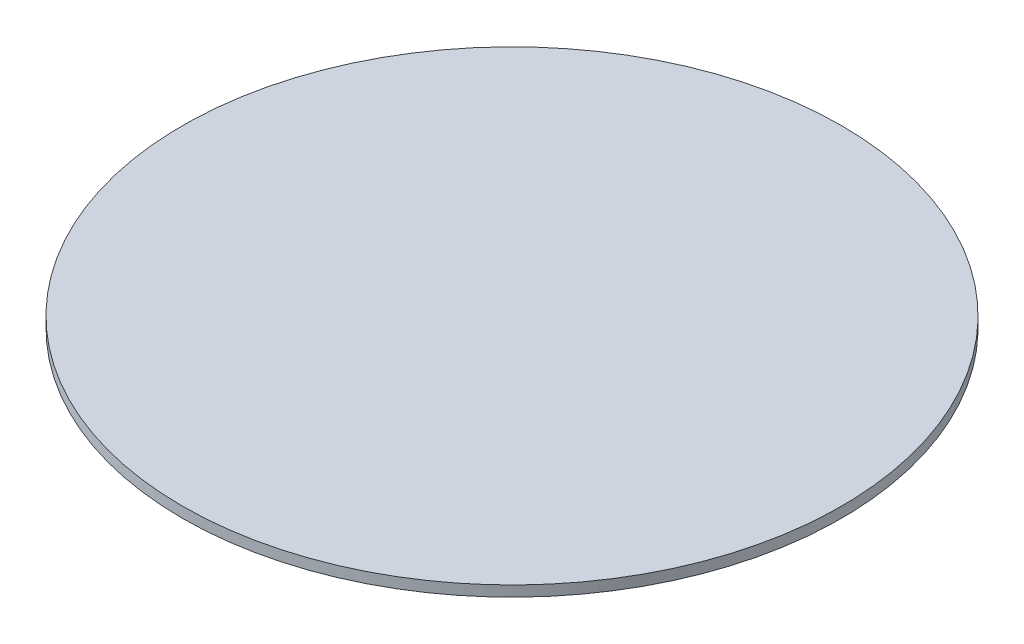
ISO-10303-21;
HEADER;
FILE_DESCRIPTION(('STEP AP214'),'2;1');
FILE_NAME('part.step','',(''),(''),'','','');
FILE_SCHEMA(('AUTOMOTIVE_DESIGN { 1 0 10303 214 1 1 1 1 }'));
ENDSEC;
DATA;
#1=APPLICATION_CONTEXT('core data for automotive mechanical design processes');
#2=APPLICATION_PROTOCOL_DEFINITION('international standard','automotive_design',2000,#1);
#3=PRODUCT_CONTEXT('',#1,'mechanical');
#4=PRODUCT('Part','Part','',(#3));
#5=PRODUCT_RELATED_PRODUCT_CATEGORY('part','',(#4));
#6=PRODUCT_DEFINITION_FORMATION('','',#4);
#7=PRODUCT_DEFINITION_CONTEXT('part definition',#1,'design');
#8=PRODUCT_DEFINITION('design','',#6,#7);
#9=PRODUCT_DEFINITION_SHAPE('','',#8);
#10=(LENGTH_UNIT() NAMED_UNIT(*) SI_UNIT(.MILLI.,.METRE.));
#11=(NAMED_UNIT(*) PLANE_ANGLE_UNIT() SI_UNIT($,.RADIAN.));
#12=(NAMED_UNIT(*) SI_UNIT($,.STERADIAN.) SOLID_ANGLE_UNIT());
#13=UNCERTAINTY_MEASURE_WITH_UNIT(LENGTH_MEASURE(1.E-05),#10,'distance_accuracy_value','');
#14=(GEOMETRIC_REPRESENTATION_CONTEXT(3) GLOBAL_UNCERTAINTY_ASSIGNED_CONTEXT((#13)) GLOBAL_UNIT_ASSIGNED_CONTEXT((#10,
#11,#12)) REPRESENTATION_CONTEXT('',''));
#15=CARTESIAN_POINT('',(0.,0.,0.));
#16=DIRECTION('',(0.,0.,1.));
#17=DIRECTION('',(1.,0.,0.));
#18=AXIS2_PLACEMENT_3D('',#15,#16,#17);
#19=CARTESIAN_POINT('',(0.,0.3,0.));
#20=DIRECTION('',(0.,-1.,0.));
#21=DIRECTION('',(0.,0.,-1.));
#22=AXIS2_PLACEMENT_3D('',#19,#20,#21);
#23=CYLINDRICAL_SURFACE('',#22,9.35);
#24=CARTESIAN_POINT('',(0.,0.3,0.));
#25=DIRECTION('',(0.,1.,0.));
#26=DIRECTION('',(0.,0.,1.));
#27=AXIS2_PLACEMENT_3D('',#24,#25,#26);
#28=CIRCLE('',#27,9.35);
#29=CARTESIAN_POINT('',(0.,0.3,9.35));
#30=VERTEX_POINT('',#29);
#31=EDGE_CURVE('E10',#30,#30,#28,.T.);
#32=ORIENTED_EDGE('',*,*,#31,.F.);
#33=EDGE_LOOP('',(#32));
#34=FACE_BOUND('',#33,.T.);
#35=CARTESIAN_POINT('',(0.,0.,0.));
#36=DIRECTION('',(0.,1.,0.));
#37=DIRECTION('',(0.,0.,1.));
#38=AXIS2_PLACEMENT_3D('',#35,#36,#37);
#39=CIRCLE('',#38,9.35);
#40=CARTESIAN_POINT('',(0.,0.,9.35));
#41=VERTEX_POINT('',#40);
#42=EDGE_CURVE('E40',#41,#41,#39,.T.);
#43=ORIENTED_EDGE('',*,*,#42,.T.);
#44=EDGE_LOOP('',(#43));
#45=FACE_BOUND('',#44,.T.);
#46=ADVANCED_FACE('F37',(#34,#45),#23,.T.);
#47=CARTESIAN_POINT('',(0.,0.3,0.));
#48=DIRECTION('',(0.,1.,0.));
#49=DIRECTION('',(0.,0.,1.));
#50=AXIS2_PLACEMENT_3D('',#47,#48,#49);
#51=PLANE('',#50);
#52=ORIENTED_EDGE('',*,*,#31,.T.);
#53=EDGE_LOOP('',(#52));
#54=FACE_BOUND('',#53,.T.);
#55=ADVANCED_FACE('F54',(#54),#51,.T.);
#56=CARTESIAN_POINT('',(0.,0.,0.));
#57=DIRECTION('',(0.,1.,0.));
#58=DIRECTION('',(0.,0.,1.));
#59=AXIS2_PLACEMENT_3D('',#56,#57,#58);
#60=PLANE('',#59);
#61=ORIENTED_EDGE('',*,*,#42,.F.);
#62=EDGE_LOOP('',(#61));
#63=FACE_BOUND('',#62,.T.);
#64=ADVANCED_FACE('F52',(#63),#60,.F.);
#65=CLOSED_SHELL('',(#46,#55,#64));
#66=MANIFOLD_SOLID_BREP('B2',#65);
#67=ADVANCED_BREP_SHAPE_REPRESENTATION('',(#18,#66),#14);
#68=SHAPE_DEFINITION_REPRESENTATION(#9,#67);
ENDSEC;
END-ISO-10303-21;
